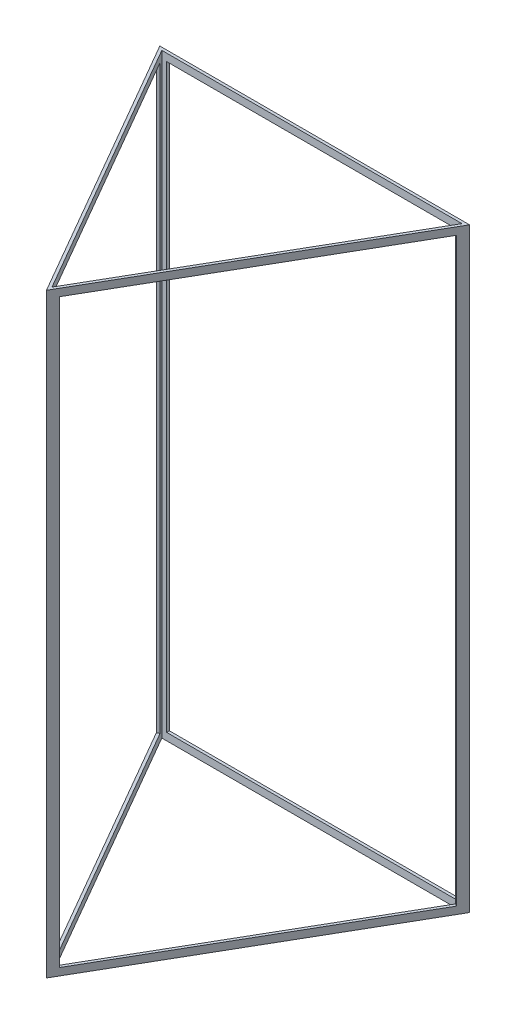
ISO-10303-21;
HEADER;
FILE_DESCRIPTION(('STEP AP214'),'2;1');
FILE_NAME('part.step','',(''),(''),'','','');
FILE_SCHEMA(('AUTOMOTIVE_DESIGN { 1 0 10303 214 1 1 1 1 }'));
ENDSEC;
DATA;
#1=APPLICATION_CONTEXT('core data for automotive mechanical design processes');
#2=APPLICATION_PROTOCOL_DEFINITION('international standard','automotive_design',2000,#1);
#3=PRODUCT_CONTEXT('',#1,'mechanical');
#4=PRODUCT('Part','Part','',(#3));
#5=PRODUCT_RELATED_PRODUCT_CATEGORY('part','',(#4));
#6=PRODUCT_DEFINITION_FORMATION('','',#4);
#7=PRODUCT_DEFINITION_CONTEXT('part definition',#1,'design');
#8=PRODUCT_DEFINITION('design','',#6,#7);
#9=PRODUCT_DEFINITION_SHAPE('','',#8);
#10=(LENGTH_UNIT() NAMED_UNIT(*) SI_UNIT(.MILLI.,.METRE.));
#11=(NAMED_UNIT(*) PLANE_ANGLE_UNIT() SI_UNIT($,.RADIAN.));
#12=(NAMED_UNIT(*) SI_UNIT($,.STERADIAN.) SOLID_ANGLE_UNIT());
#13=UNCERTAINTY_MEASURE_WITH_UNIT(LENGTH_MEASURE(1.E-05),#10,'distance_accuracy_value','');
#14=(GEOMETRIC_REPRESENTATION_CONTEXT(3) GLOBAL_UNCERTAINTY_ASSIGNED_CONTEXT((#13)) GLOBAL_UNIT_ASSIGNED_CONTEXT((#10,
#11,#12)) REPRESENTATION_CONTEXT('',''));
#15=CARTESIAN_POINT('',(0.,0.,0.));
#16=DIRECTION('',(0.,0.,1.));
#17=DIRECTION('',(1.,0.,0.));
#18=AXIS2_PLACEMENT_3D('',#15,#16,#17);
#19=CARTESIAN_POINT('',(0.,2500.,0.));
#20=DIRECTION('',(0.,1.,0.));
#21=DIRECTION('',(0.,0.,1.));
#22=AXIS2_PLACEMENT_3D('',#19,#20,#21);
#23=PLANE('',#22);
#24=DIRECTION('',(0.5,0.,0.866025403784439));
#25=VECTOR('',#24,1.);
#26=CARTESIAN_POINT('',(-650.,2500.,-1125.83302491977));
#27=LINE('',#26,#25);
#28=CARTESIAN_POINT('',(-650.,2500.,-1125.83302491977));
#29=VERTEX_POINT('',#28);
#30=CARTESIAN_POINT('',(0.,2500.,0.));
#31=VERTEX_POINT('',#30);
#32=EDGE_CURVE('E250',#29,#31,#27,.T.);
#33=ORIENTED_EDGE('',*,*,#32,.T.);
#34=DIRECTION('',(0.5,0.,-0.866025403784439));
#35=VECTOR('',#34,1.);
#36=CARTESIAN_POINT('',(0.,2500.,0.));
#37=LINE('',#36,#35);
#38=CARTESIAN_POINT('',(650.,2500.,-1125.83302491977));
#39=VERTEX_POINT('',#38);
#40=EDGE_CURVE('E253',#31,#39,#37,.T.);
#41=ORIENTED_EDGE('',*,*,#40,.T.);
#42=DIRECTION('',(-1.,0.,0.));
#43=VECTOR('',#42,1.);
#44=CARTESIAN_POINT('',(650.,2500.,-1125.83302491977));
#45=LINE('',#44,#43);
#46=EDGE_CURVE('E256',#39,#29,#45,.T.);
#47=ORIENTED_EDGE('',*,*,#46,.T.);
#48=EDGE_LOOP('',(#33,#41,#47));
#49=FACE_BOUND('',#48,.T.);
#50=DIRECTION('',(0.5,0.,-0.866025403784438));
#51=VECTOR('',#50,1.);
#52=CARTESIAN_POINT('',(8.40039843241769E-13,2500.,-23.0940107675844));
#53=LINE('',#52,#51);
#54=CARTESIAN_POINT('',(8.40039843241769E-13,2500.,-23.0940107675844));
#55=VERTEX_POINT('',#54);
#56=CARTESIAN_POINT('',(630.000000000001,2500.,-1114.28601953598));
#57=VERTEX_POINT('',#56);
#58=EDGE_CURVE('E228',#55,#57,#53,.T.);
#59=ORIENTED_EDGE('',*,*,#58,.F.);
#60=DIRECTION('',(0.5,0.,0.866025403784439));
#61=VECTOR('',#60,1.);
#62=CARTESIAN_POINT('',(-629.999999999999,2500.,-1114.28601953598));
#63=LINE('',#62,#61);
#64=CARTESIAN_POINT('',(-629.999999999999,2500.,-1114.28601953598));
#65=VERTEX_POINT('',#64);
#66=EDGE_CURVE('E226',#65,#55,#63,.T.);
#67=ORIENTED_EDGE('',*,*,#66,.F.);
#68=DIRECTION('',(-1.,0.,0.));
#69=VECTOR('',#68,1.);
#70=CARTESIAN_POINT('',(630.000000000001,2500.,-1114.28601953598));
#71=LINE('',#70,#69);
#72=EDGE_CURVE('E232',#57,#65,#71,.T.);
#73=ORIENTED_EDGE('',*,*,#72,.F.);
#74=EDGE_LOOP('',(#59,#67,#73));
#75=FACE_BOUND('',#74,.T.);
#76=ADVANCED_FACE('F33',(#49,#75),#23,.T.);
#77=CARTESIAN_POINT('',(0.,0.,0.));
#78=DIRECTION('',(0.,1.,0.));
#79=DIRECTION('',(0.,0.,1.));
#80=AXIS2_PLACEMENT_3D('',#77,#78,#79);
#81=PLANE('',#80);
#82=DIRECTION('',(0.5,0.,0.866025403784439));
#83=VECTOR('',#82,1.);
#84=CARTESIAN_POINT('',(-650.,0.,-1125.83302491977));
#85=LINE('',#84,#83);
#86=CARTESIAN_POINT('',(-650.,0.,-1125.83302491977));
#87=VERTEX_POINT('',#86);
#88=CARTESIAN_POINT('',(0.,0.,0.));
#89=VERTEX_POINT('',#88);
#90=EDGE_CURVE('E249',#87,#89,#85,.T.);
#91=ORIENTED_EDGE('',*,*,#90,.F.);
#92=DIRECTION('',(-1.,0.,0.));
#93=VECTOR('',#92,1.);
#94=CARTESIAN_POINT('',(650.,0.,-1125.83302491977));
#95=LINE('',#94,#93);
#96=CARTESIAN_POINT('',(650.,0.,-1125.83302491977));
#97=VERTEX_POINT('',#96);
#98=EDGE_CURVE('E254',#97,#87,#95,.T.);
#99=ORIENTED_EDGE('',*,*,#98,.F.);
#100=DIRECTION('',(0.5,0.,-0.866025403784439));
#101=VECTOR('',#100,1.);
#102=CARTESIAN_POINT('',(0.,0.,0.));
#103=LINE('',#102,#101);
#104=EDGE_CURVE('E261',#89,#97,#103,.T.);
#105=ORIENTED_EDGE('',*,*,#104,.F.);
#106=EDGE_LOOP('',(#91,#99,#105));
#107=FACE_BOUND('',#106,.T.);
#108=DIRECTION('',(0.5,0.,0.866025403784439));
#109=VECTOR('',#108,1.);
#110=CARTESIAN_POINT('',(-629.999999999999,0.,-1114.28601953598));
#111=LINE('',#110,#109);
#112=CARTESIAN_POINT('',(-629.999999999999,0.,-1114.28601953598));
#113=VERTEX_POINT('',#112);
#114=CARTESIAN_POINT('',(8.40039843241769E-13,0.,-23.0940107675844));
#115=VERTEX_POINT('',#114);
#116=EDGE_CURVE('E219',#113,#115,#111,.T.);
#117=ORIENTED_EDGE('',*,*,#116,.T.);
#118=DIRECTION('',(0.5,0.,-0.866025403784438));
#119=VECTOR('',#118,1.);
#120=CARTESIAN_POINT('',(8.40039843241769E-13,0.,-23.0940107675844));
#121=LINE('',#120,#119);
#122=CARTESIAN_POINT('',(630.000000000001,0.,-1114.28601953598));
#123=VERTEX_POINT('',#122);
#124=EDGE_CURVE('E237',#115,#123,#121,.T.);
#125=ORIENTED_EDGE('',*,*,#124,.T.);
#126=DIRECTION('',(-1.,0.,0.));
#127=VECTOR('',#126,1.);
#128=CARTESIAN_POINT('',(630.000000000001,0.,-1114.28601953598));
#129=LINE('',#128,#127);
#130=EDGE_CURVE('E229',#123,#113,#129,.T.);
#131=ORIENTED_EDGE('',*,*,#130,.T.);
#132=EDGE_LOOP('',(#117,#125,#131));
#133=FACE_BOUND('',#132,.T.);
#134=ADVANCED_FACE('F315',(#107,#133),#81,.F.);
#135=CARTESIAN_POINT('',(-650.,2500.,-1125.83302491977));
#136=DIRECTION('',(0.866025403784439,0.,-0.5));
#137=DIRECTION('',(-0.5,0.,-0.866025403784439));
#138=AXIS2_PLACEMENT_3D('',#135,#136,#137);
#139=PLANE('',#138);
#140=DIRECTION('',(-0.5,0.,-0.866025403784439));
#141=VECTOR('',#140,1.);
#142=CARTESIAN_POINT('',(-629.8,2469.2,-1090.84559860688));
#143=LINE('',#142,#141);
#144=CARTESIAN_POINT('',(-20.1999999999999,2469.2,-34.9874263128913));
#145=VERTEX_POINT('',#144);
#146=CARTESIAN_POINT('',(-629.8,2469.2,-1090.84559860688));
#147=VERTEX_POINT('',#146);
#148=EDGE_CURVE('E187',#145,#147,#143,.T.);
#149=ORIENTED_EDGE('',*,*,#148,.F.);
#150=DIRECTION('',(0.,1.,0.));
#151=VECTOR('',#150,1.);
#152=CARTESIAN_POINT('',(-20.1999999999999,30.7999999999999,-34.9874263128912));
#153=LINE('',#152,#151);
#154=CARTESIAN_POINT('',(-20.1999999999999,30.7999999999999,-34.9874263128912));
#155=VERTEX_POINT('',#154);
#156=EDGE_CURVE('E183',#155,#145,#153,.T.);
#157=ORIENTED_EDGE('',*,*,#156,.F.);
#158=DIRECTION('',(0.5,0.,0.866025403784439));
#159=VECTOR('',#158,1.);
#160=CARTESIAN_POINT('',(-629.8,30.7999999999999,-1090.84559860688));
#161=LINE('',#160,#159);
#162=CARTESIAN_POINT('',(-629.8,30.7999999999999,-1090.84559860688));
#163=VERTEX_POINT('',#162);
#164=EDGE_CURVE('E193',#163,#155,#161,.T.);
#165=ORIENTED_EDGE('',*,*,#164,.F.);
#166=DIRECTION('',(0.,-1.,0.));
#167=VECTOR('',#166,1.);
#168=CARTESIAN_POINT('',(-629.8,30.7999999999999,-1090.84559860688));
#169=LINE('',#168,#167);
#170=EDGE_CURVE('E190',#147,#163,#169,.T.);
#171=ORIENTED_EDGE('',*,*,#170,.F.);
#172=EDGE_LOOP('',(#149,#157,#165,#171));
#173=FACE_BOUND('',#172,.T.);
#174=ORIENTED_EDGE('',*,*,#90,.T.);
#175=DIRECTION('',(0.,-1.,0.));
#176=VECTOR('',#175,1.);
#177=CARTESIAN_POINT('',(0.,2500.,0.));
#178=LINE('',#177,#176);
#179=EDGE_CURVE('E269',#31,#89,#178,.T.);
#180=ORIENTED_EDGE('',*,*,#179,.F.);
#181=ORIENTED_EDGE('',*,*,#32,.F.);
#182=DIRECTION('',(0.,-1.,0.));
#183=VECTOR('',#182,1.);
#184=CARTESIAN_POINT('',(-650.,2500.,-1125.83302491977));
#185=LINE('',#184,#183);
#186=EDGE_CURVE('E258',#29,#87,#185,.T.);
#187=ORIENTED_EDGE('',*,*,#186,.T.);
#188=EDGE_LOOP('',(#174,#180,#181,#187));
#189=FACE_BOUND('',#188,.T.);
#190=ADVANCED_FACE('F35',(#173,#189),#139,.F.);
#191=CARTESIAN_POINT('',(0.,2500.,0.));
#192=DIRECTION('',(-0.866025403784439,0.,-0.5));
#193=DIRECTION('',(-0.5,0.,0.866025403784439));
#194=AXIS2_PLACEMENT_3D('',#191,#192,#193);
#195=PLANE('',#194);
#196=DIRECTION('',(-0.5,0.,0.866025403784439));
#197=VECTOR('',#196,1.);
#198=CARTESIAN_POINT('',(20.2000000000001,2469.2,-34.9874263128915));
#199=LINE('',#198,#197);
#200=CARTESIAN_POINT('',(629.8,2469.2,-1090.84559860688));
#201=VERTEX_POINT('',#200);
#202=CARTESIAN_POINT('',(20.2000000000001,2469.2,-34.9874263128915));
#203=VERTEX_POINT('',#202);
#204=EDGE_CURVE('E169',#201,#203,#199,.T.);
#205=ORIENTED_EDGE('',*,*,#204,.F.);
#206=DIRECTION('',(0.,1.,0.));
#207=VECTOR('',#206,1.);
#208=CARTESIAN_POINT('',(629.8,30.8000000000002,-1090.84559860688));
#209=LINE('',#208,#207);
#210=CARTESIAN_POINT('',(629.8,30.8000000000002,-1090.84559860688));
#211=VERTEX_POINT('',#210);
#212=EDGE_CURVE('E48',#211,#201,#209,.T.);
#213=ORIENTED_EDGE('',*,*,#212,.F.);
#214=DIRECTION('',(0.5,0.,-0.866025403784439));
#215=VECTOR('',#214,1.);
#216=CARTESIAN_POINT('',(20.2000000000001,30.8000000000002,-34.9874263128915));
#217=LINE('',#216,#215);
#218=CARTESIAN_POINT('',(20.2000000000001,30.8000000000002,-34.9874263128915));
#219=VERTEX_POINT('',#218);
#220=EDGE_CURVE('E176',#219,#211,#217,.T.);
#221=ORIENTED_EDGE('',*,*,#220,.F.);
#222=DIRECTION('',(0.,-1.,0.));
#223=VECTOR('',#222,1.);
#224=CARTESIAN_POINT('',(20.2000000000001,30.8000000000002,-34.9874263128915));
#225=LINE('',#224,#223);
#226=EDGE_CURVE('E160',#203,#219,#225,.T.);
#227=ORIENTED_EDGE('',*,*,#226,.F.);
#228=EDGE_LOOP('',(#205,#213,#221,#227));
#229=FACE_BOUND('',#228,.T.);
#230=ORIENTED_EDGE('',*,*,#104,.T.);
#231=DIRECTION('',(0.,-1.,0.));
#232=VECTOR('',#231,1.);
#233=CARTESIAN_POINT('',(650.,2500.,-1125.83302491977));
#234=LINE('',#233,#232);
#235=EDGE_CURVE('E266',#39,#97,#234,.T.);
#236=ORIENTED_EDGE('',*,*,#235,.F.);
#237=ORIENTED_EDGE('',*,*,#40,.F.);
#238=ORIENTED_EDGE('',*,*,#179,.T.);
#239=EDGE_LOOP('',(#230,#236,#237,#238));
#240=FACE_BOUND('',#239,.T.);
#241=ADVANCED_FACE('F173',(#229,#240),#195,.F.);
#242=CARTESIAN_POINT('',(650.,2500.,-1125.83302491977));
#243=DIRECTION('',(0.,0.,1.));
#244=DIRECTION('',(1.,0.,0.));
#245=AXIS2_PLACEMENT_3D('',#242,#243,#244);
#246=PLANE('',#245);
#247=DIRECTION('',(1.,0.,0.));
#248=VECTOR('',#247,1.);
#249=CARTESIAN_POINT('',(609.6,2469.2,-1125.83302491977));
#250=LINE('',#249,#248);
#251=CARTESIAN_POINT('',(-609.6,2469.2,-1125.83302491977));
#252=VERTEX_POINT('',#251);
#253=CARTESIAN_POINT('',(609.6,2469.2,-1125.83302491977));
#254=VERTEX_POINT('',#253);
#255=EDGE_CURVE('E207',#252,#254,#250,.T.);
#256=ORIENTED_EDGE('',*,*,#255,.F.);
#257=DIRECTION('',(0.,1.,0.));
#258=VECTOR('',#257,1.);
#259=CARTESIAN_POINT('',(-609.6,30.8000000000004,-1125.83302491977));
#260=LINE('',#259,#258);
#261=CARTESIAN_POINT('',(-609.6,30.8000000000004,-1125.83302491977));
#262=VERTEX_POINT('',#261);
#263=EDGE_CURVE('E199',#262,#252,#260,.T.);
#264=ORIENTED_EDGE('',*,*,#263,.F.);
#265=DIRECTION('',(-1.,0.,0.));
#266=VECTOR('',#265,1.);
#267=CARTESIAN_POINT('',(609.6,30.8000000000004,-1125.83302491977));
#268=LINE('',#267,#266);
#269=CARTESIAN_POINT('',(609.6,30.8000000000004,-1125.83302491977));
#270=VERTEX_POINT('',#269);
#271=EDGE_CURVE('E213',#270,#262,#268,.T.);
#272=ORIENTED_EDGE('',*,*,#271,.F.);
#273=DIRECTION('',(0.,-1.,0.));
#274=VECTOR('',#273,1.);
#275=CARTESIAN_POINT('',(609.6,30.8000000000004,-1125.83302491977));
#276=LINE('',#275,#274);
#277=EDGE_CURVE('E210',#254,#270,#276,.T.);
#278=ORIENTED_EDGE('',*,*,#277,.F.);
#279=EDGE_LOOP('',(#256,#264,#272,#278));
#280=FACE_BOUND('',#279,.T.);
#281=ORIENTED_EDGE('',*,*,#98,.T.);
#282=ORIENTED_EDGE('',*,*,#186,.F.);
#283=ORIENTED_EDGE('',*,*,#46,.F.);
#284=ORIENTED_EDGE('',*,*,#235,.T.);
#285=EDGE_LOOP('',(#281,#282,#283,#284));
#286=FACE_BOUND('',#285,.T.);
#287=ADVANCED_FACE('F328',(#280,#286),#246,.F.);
#288=CARTESIAN_POINT('',(-629.999999999999,2500.,-1114.28601953598));
#289=DIRECTION('',(0.866025403784439,0.,-0.5));
#290=DIRECTION('',(-0.5,0.,-0.866025403784439));
#291=AXIS2_PLACEMENT_3D('',#288,#289,#290);
#292=PLANE('',#291);
#293=DIRECTION('',(0.,-1.,0.));
#294=VECTOR('',#293,1.);
#295=CARTESIAN_POINT('',(-10.1999999999994,2500.,-40.7609290047874));
#296=LINE('',#295,#294);
#297=CARTESIAN_POINT('',(-10.1999999999995,2469.2,-40.7609290047877));
#298=VERTEX_POINT('',#297);
#299=CARTESIAN_POINT('',(-10.1999999999995,30.8000000000001,-40.7609290047877));
#300=VERTEX_POINT('',#299);
#301=EDGE_CURVE('E288',#298,#300,#296,.T.);
#302=ORIENTED_EDGE('',*,*,#301,.F.);
#303=DIRECTION('',(0.5,0.,0.866025403784439));
#304=VECTOR('',#303,1.);
#305=CARTESIAN_POINT('',(-629.999999999999,2469.2,-1114.28601953598));
#306=LINE('',#305,#304);
#307=CARTESIAN_POINT('',(-619.799999999999,2469.2,-1096.61910129878));
#308=VERTEX_POINT('',#307);
#309=EDGE_CURVE('E281',#308,#298,#306,.T.);
#310=ORIENTED_EDGE('',*,*,#309,.F.);
#311=DIRECTION('',(0.,1.,0.));
#312=VECTOR('',#311,1.);
#313=CARTESIAN_POINT('',(-619.799999999999,2500.,-1096.61910129878));
#314=LINE('',#313,#312);
#315=CARTESIAN_POINT('',(-619.799999999999,30.7999999999999,-1096.61910129878));
#316=VERTEX_POINT('',#315);
#317=EDGE_CURVE('E283',#316,#308,#314,.T.);
#318=ORIENTED_EDGE('',*,*,#317,.F.);
#319=DIRECTION('',(-0.5,0.,-0.866025403784439));
#320=VECTOR('',#319,1.);
#321=CARTESIAN_POINT('',(-629.999999999999,30.8000000000002,-1114.28601953598));
#322=LINE('',#321,#320);
#323=EDGE_CURVE('E286',#300,#316,#322,.T.);
#324=ORIENTED_EDGE('',*,*,#323,.F.);
#325=EDGE_LOOP('',(#302,#310,#318,#324));
#326=FACE_BOUND('',#325,.T.);
#327=ORIENTED_EDGE('',*,*,#116,.F.);
#328=DIRECTION('',(0.,-1.,0.));
#329=VECTOR('',#328,1.);
#330=CARTESIAN_POINT('',(-629.999999999999,2500.,-1114.28601953598));
#331=LINE('',#330,#329);
#332=EDGE_CURVE('E234',#65,#113,#331,.T.);
#333=ORIENTED_EDGE('',*,*,#332,.F.);
#334=ORIENTED_EDGE('',*,*,#66,.T.);
#335=DIRECTION('',(0.,-1.,0.));
#336=VECTOR('',#335,1.);
#337=CARTESIAN_POINT('',(8.40039843241769E-13,2500.,-23.0940107675844));
#338=LINE('',#337,#336);
#339=EDGE_CURVE('E246',#55,#115,#338,.T.);
#340=ORIENTED_EDGE('',*,*,#339,.T.);
#341=EDGE_LOOP('',(#327,#333,#334,#340));
#342=FACE_BOUND('',#341,.T.);
#343=ADVANCED_FACE('F325',(#326,#342),#292,.T.);
#344=CARTESIAN_POINT('',(8.40039843241769E-13,2500.,-23.0940107675844));
#345=DIRECTION('',(-0.866025403784439,0.,-0.5));
#346=DIRECTION('',(-0.5,0.,0.866025403784439));
#347=AXIS2_PLACEMENT_3D('',#344,#345,#346);
#348=PLANE('',#347);
#349=DIRECTION('',(0.,-1.,0.));
#350=VECTOR('',#349,1.);
#351=CARTESIAN_POINT('',(619.800000000001,2500.,-1096.61910129878));
#352=LINE('',#351,#350);
#353=CARTESIAN_POINT('',(619.800000000001,2469.2,-1096.61910129878));
#354=VERTEX_POINT('',#353);
#355=CARTESIAN_POINT('',(619.800000000001,30.8000000000002,-1096.61910129878));
#356=VERTEX_POINT('',#355);
#357=EDGE_CURVE('E11',#354,#356,#352,.T.);
#358=ORIENTED_EDGE('',*,*,#357,.F.);
#359=DIRECTION('',(0.5,0.,-0.866025403784439));
#360=VECTOR('',#359,1.);
#361=CARTESIAN_POINT('',(8.40039843241769E-13,2469.2,-23.0940107675844));
#362=LINE('',#361,#360);
#363=CARTESIAN_POINT('',(10.200000000001,2469.2,-40.7609290047873));
#364=VERTEX_POINT('',#363);
#365=EDGE_CURVE('E290',#364,#354,#362,.T.);
#366=ORIENTED_EDGE('',*,*,#365,.F.);
#367=DIRECTION('',(0.,1.,0.));
#368=VECTOR('',#367,1.);
#369=CARTESIAN_POINT('',(10.200000000001,2500.,-40.7609290047873));
#370=LINE('',#369,#368);
#371=CARTESIAN_POINT('',(10.200000000001,30.8000000000002,-40.7609290047873));
#372=VERTEX_POINT('',#371);
#373=EDGE_CURVE('E163',#372,#364,#370,.T.);
#374=ORIENTED_EDGE('',*,*,#373,.F.);
#375=DIRECTION('',(-0.5,0.,0.866025403784439));
#376=VECTOR('',#375,1.);
#377=CARTESIAN_POINT('',(8.40039843241769E-13,30.8000000000002,-23.0940107675844));
#378=LINE('',#377,#376);
#379=EDGE_CURVE('E41',#356,#372,#378,.T.);
#380=ORIENTED_EDGE('',*,*,#379,.F.);
#381=EDGE_LOOP('',(#358,#366,#374,#380));
#382=FACE_BOUND('',#381,.T.);
#383=ORIENTED_EDGE('',*,*,#124,.F.);
#384=ORIENTED_EDGE('',*,*,#339,.F.);
#385=ORIENTED_EDGE('',*,*,#58,.T.);
#386=DIRECTION('',(0.,-1.,0.));
#387=VECTOR('',#386,1.);
#388=CARTESIAN_POINT('',(630.000000000001,2500.,-1114.28601953598));
#389=LINE('',#388,#387);
#390=EDGE_CURVE('E244',#57,#123,#389,.T.);
#391=ORIENTED_EDGE('',*,*,#390,.T.);
#392=EDGE_LOOP('',(#383,#384,#385,#391));
#393=FACE_BOUND('',#392,.T.);
#394=ADVANCED_FACE('F298',(#382,#393),#348,.T.);
#395=CARTESIAN_POINT('',(630.000000000001,2500.,-1114.28601953598));
#396=DIRECTION('',(0.,0.,1.));
#397=DIRECTION('',(1.,0.,0.));
#398=AXIS2_PLACEMENT_3D('',#395,#396,#397);
#399=PLANE('',#398);
#400=DIRECTION('',(0.,-1.,0.));
#401=VECTOR('',#400,1.);
#402=CARTESIAN_POINT('',(-609.6,2500.,-1114.28601953598));
#403=LINE('',#402,#401);
#404=CARTESIAN_POINT('',(-609.6,2469.2,-1114.28601953598));
#405=VERTEX_POINT('',#404);
#406=CARTESIAN_POINT('',(-609.6,30.8000000000004,-1114.28601953598));
#407=VERTEX_POINT('',#406);
#408=EDGE_CURVE('E279',#405,#407,#403,.T.);
#409=ORIENTED_EDGE('',*,*,#408,.F.);
#410=DIRECTION('',(-1.,0.,0.));
#411=VECTOR('',#410,1.);
#412=CARTESIAN_POINT('',(630.000000000001,2469.2,-1114.28601953598));
#413=LINE('',#412,#411);
#414=CARTESIAN_POINT('',(609.6,2469.2,-1114.28601953598));
#415=VERTEX_POINT('',#414);
#416=EDGE_CURVE('E272',#415,#405,#413,.T.);
#417=ORIENTED_EDGE('',*,*,#416,.F.);
#418=DIRECTION('',(0.,1.,0.));
#419=VECTOR('',#418,1.);
#420=CARTESIAN_POINT('',(609.6,2500.,-1114.28601953598));
#421=LINE('',#420,#419);
#422=CARTESIAN_POINT('',(609.6,30.8000000000004,-1114.28601953598));
#423=VERTEX_POINT('',#422);
#424=EDGE_CURVE('E274',#423,#415,#421,.T.);
#425=ORIENTED_EDGE('',*,*,#424,.F.);
#426=DIRECTION('',(1.,0.,0.));
#427=VECTOR('',#426,1.);
#428=CARTESIAN_POINT('',(630.000000000001,30.8000000000002,-1114.28601953598));
#429=LINE('',#428,#427);
#430=EDGE_CURVE('E277',#407,#423,#429,.T.);
#431=ORIENTED_EDGE('',*,*,#430,.F.);
#432=EDGE_LOOP('',(#409,#417,#425,#431));
#433=FACE_BOUND('',#432,.T.);
#434=ORIENTED_EDGE('',*,*,#130,.F.);
#435=ORIENTED_EDGE('',*,*,#390,.F.);
#436=ORIENTED_EDGE('',*,*,#72,.T.);
#437=ORIENTED_EDGE('',*,*,#332,.T.);
#438=EDGE_LOOP('',(#434,#435,#436,#437));
#439=FACE_BOUND('',#438,.T.);
#440=ADVANCED_FACE('F357',(#433,#439),#399,.T.);
#441=CARTESIAN_POINT('',(-609.6,30.8000000000004,-1104.83302491977));
#442=DIRECTION('',(-1.,0.,0.));
#443=DIRECTION('',(0.,0.,1.));
#444=AXIS2_PLACEMENT_3D('',#441,#442,#443);
#445=PLANE('',#444);
#446=ORIENTED_EDGE('',*,*,#408,.T.);
#447=DIRECTION('',(0.,0.,-1.));
#448=VECTOR('',#447,1.);
#449=CARTESIAN_POINT('',(-609.6,30.8000000000004,-1104.83302491977));
#450=LINE('',#449,#448);
#451=EDGE_CURVE('E217',#407,#262,#450,.T.);
#452=ORIENTED_EDGE('',*,*,#451,.T.);
#453=ORIENTED_EDGE('',*,*,#263,.T.);
#454=DIRECTION('',(0.,0.,-1.));
#455=VECTOR('',#454,1.);
#456=CARTESIAN_POINT('',(-609.6,2469.2,-1104.83302491977));
#457=LINE('',#456,#455);
#458=EDGE_CURVE('E216',#405,#252,#457,.T.);
#459=ORIENTED_EDGE('',*,*,#458,.F.);
#460=EDGE_LOOP('',(#446,#452,#453,#459));
#461=FACE_BOUND('',#460,.T.);
#462=ADVANCED_FACE('F365',(#461),#445,.F.);
#463=CARTESIAN_POINT('',(609.6,30.8000000000004,-1104.83302491977));
#464=DIRECTION('',(0.,-1.,0.));
#465=DIRECTION('',(0.,0.,-1.));
#466=AXIS2_PLACEMENT_3D('',#463,#464,#465);
#467=PLANE('',#466);
#468=ORIENTED_EDGE('',*,*,#430,.T.);
#469=DIRECTION('',(0.,0.,-1.));
#470=VECTOR('',#469,1.);
#471=CARTESIAN_POINT('',(609.6,30.8000000000004,-1104.83302491977));
#472=LINE('',#471,#470);
#473=EDGE_CURVE('E220',#423,#270,#472,.T.);
#474=ORIENTED_EDGE('',*,*,#473,.T.);
#475=ORIENTED_EDGE('',*,*,#271,.T.);
#476=ORIENTED_EDGE('',*,*,#451,.F.);
#477=EDGE_LOOP('',(#468,#474,#475,#476));
#478=FACE_BOUND('',#477,.T.);
#479=ADVANCED_FACE('F372',(#478),#467,.F.);
#480=CARTESIAN_POINT('',(609.6,30.8000000000004,-1104.83302491977));
#481=DIRECTION('',(1.,0.,0.));
#482=DIRECTION('',(0.,0.,-1.));
#483=AXIS2_PLACEMENT_3D('',#480,#481,#482);
#484=PLANE('',#483);
#485=ORIENTED_EDGE('',*,*,#424,.T.);
#486=DIRECTION('',(0.,0.,-1.));
#487=VECTOR('',#486,1.);
#488=CARTESIAN_POINT('',(609.6,2469.2,-1104.83302491977));
#489=LINE('',#488,#487);
#490=EDGE_CURVE('E222',#415,#254,#489,.T.);
#491=ORIENTED_EDGE('',*,*,#490,.T.);
#492=ORIENTED_EDGE('',*,*,#277,.T.);
#493=ORIENTED_EDGE('',*,*,#473,.F.);
#494=EDGE_LOOP('',(#485,#491,#492,#493));
#495=FACE_BOUND('',#494,.T.);
#496=ADVANCED_FACE('F378',(#495),#484,.F.);
#497=CARTESIAN_POINT('',(609.6,2469.2,-1104.83302491977));
#498=DIRECTION('',(0.,1.,0.));
#499=DIRECTION('',(0.,0.,1.));
#500=AXIS2_PLACEMENT_3D('',#497,#498,#499);
#501=PLANE('',#500);
#502=ORIENTED_EDGE('',*,*,#416,.T.);
#503=ORIENTED_EDGE('',*,*,#458,.T.);
#504=ORIENTED_EDGE('',*,*,#255,.T.);
#505=ORIENTED_EDGE('',*,*,#490,.F.);
#506=EDGE_LOOP('',(#502,#503,#504,#505));
#507=FACE_BOUND('',#506,.T.);
#508=ADVANCED_FACE('F374',(#507),#501,.F.);
#509=CARTESIAN_POINT('',(-2.01346652052638,30.7999999999999,-45.4874263128914));
#510=DIRECTION('',(0.5,0.,0.866025403784439));
#511=DIRECTION('',(0.866025403784439,0.,-0.5));
#512=AXIS2_PLACEMENT_3D('',#509,#510,#511);
#513=PLANE('',#512);
#514=ORIENTED_EDGE('',*,*,#301,.T.);
#515=DIRECTION('',(-0.866025403784439,0.,0.5));
#516=VECTOR('',#515,1.);
#517=CARTESIAN_POINT('',(-2.01346652052638,30.7999999999999,-45.4874263128914));
#518=LINE('',#517,#516);
#519=EDGE_CURVE('E197',#300,#155,#518,.T.);
#520=ORIENTED_EDGE('',*,*,#519,.T.);
#521=ORIENTED_EDGE('',*,*,#156,.T.);
#522=DIRECTION('',(-0.866025403784439,0.,0.5));
#523=VECTOR('',#522,1.);
#524=CARTESIAN_POINT('',(-2.01346652052638,2469.2,-45.4874263128914));
#525=LINE('',#524,#523);
#526=EDGE_CURVE('E196',#298,#145,#525,.T.);
#527=ORIENTED_EDGE('',*,*,#526,.F.);
#528=EDGE_LOOP('',(#514,#520,#521,#527));
#529=FACE_BOUND('',#528,.T.);
#530=ADVANCED_FACE('F377',(#529),#513,.F.);
#531=CARTESIAN_POINT('',(-611.613466520526,30.7999999999999,-1101.34559860688));
#532=DIRECTION('',(0.,-1.,0.));
#533=DIRECTION('',(0.,0.,-1.));
#534=AXIS2_PLACEMENT_3D('',#531,#532,#533);
#535=PLANE('',#534);
#536=ORIENTED_EDGE('',*,*,#323,.T.);
#537=DIRECTION('',(-0.866025403784439,0.,0.5));
#538=VECTOR('',#537,1.);
#539=CARTESIAN_POINT('',(-611.613466520526,30.7999999999999,-1101.34559860688));
#540=LINE('',#539,#538);
#541=EDGE_CURVE('E200',#316,#163,#540,.T.);
#542=ORIENTED_EDGE('',*,*,#541,.T.);
#543=ORIENTED_EDGE('',*,*,#164,.T.);
#544=ORIENTED_EDGE('',*,*,#519,.F.);
#545=EDGE_LOOP('',(#536,#542,#543,#544));
#546=FACE_BOUND('',#545,.T.);
#547=ADVANCED_FACE('F387',(#546),#535,.F.);
#548=CARTESIAN_POINT('',(-611.613466520526,30.7999999999999,-1101.34559860688));
#549=DIRECTION('',(-0.5,0.,-0.866025403784439));
#550=DIRECTION('',(-0.866025403784439,0.,0.5));
#551=AXIS2_PLACEMENT_3D('',#548,#549,#550);
#552=PLANE('',#551);
#553=ORIENTED_EDGE('',*,*,#317,.T.);
#554=DIRECTION('',(-0.866025403784439,0.,0.5));
#555=VECTOR('',#554,1.);
#556=CARTESIAN_POINT('',(-611.613466520526,2469.2,-1101.34559860688));
#557=LINE('',#556,#555);
#558=EDGE_CURVE('E202',#308,#147,#557,.T.);
#559=ORIENTED_EDGE('',*,*,#558,.T.);
#560=ORIENTED_EDGE('',*,*,#170,.T.);
#561=ORIENTED_EDGE('',*,*,#541,.F.);
#562=EDGE_LOOP('',(#553,#559,#560,#561));
#563=FACE_BOUND('',#562,.T.);
#564=ADVANCED_FACE('F309',(#563),#552,.F.);
#565=CARTESIAN_POINT('',(-611.613466520526,2469.2,-1101.34559860688));
#566=DIRECTION('',(0.,1.,0.));
#567=DIRECTION('',(0.,0.,1.));
#568=AXIS2_PLACEMENT_3D('',#565,#566,#567);
#569=PLANE('',#568);
#570=ORIENTED_EDGE('',*,*,#309,.T.);
#571=ORIENTED_EDGE('',*,*,#526,.T.);
#572=ORIENTED_EDGE('',*,*,#148,.T.);
#573=ORIENTED_EDGE('',*,*,#558,.F.);
#574=EDGE_LOOP('',(#570,#571,#572,#573));
#575=FACE_BOUND('',#574,.T.);
#576=ADVANCED_FACE('F302',(#575),#569,.F.);
#577=CARTESIAN_POINT('',(611.613466520527,30.8000000000002,-1101.34559860688));
#578=DIRECTION('',(0.5,0.,-0.866025403784439));
#579=DIRECTION('',(-0.866025403784439,0.,-0.5));
#580=AXIS2_PLACEMENT_3D('',#577,#578,#579);
#581=PLANE('',#580);
#582=ORIENTED_EDGE('',*,*,#357,.T.);
#583=DIRECTION('',(0.866025403784439,0.,0.5));
#584=VECTOR('',#583,1.);
#585=CARTESIAN_POINT('',(611.613466520527,30.8000000000002,-1101.34559860688));
#586=LINE('',#585,#584);
#587=EDGE_CURVE('E181',#356,#211,#586,.T.);
#588=ORIENTED_EDGE('',*,*,#587,.T.);
#589=ORIENTED_EDGE('',*,*,#212,.T.);
#590=DIRECTION('',(0.866025403784439,0.,0.5));
#591=VECTOR('',#590,1.);
#592=CARTESIAN_POINT('',(611.613466520527,2469.2,-1101.34559860688));
#593=LINE('',#592,#591);
#594=EDGE_CURVE('E166',#354,#201,#593,.T.);
#595=ORIENTED_EDGE('',*,*,#594,.F.);
#596=EDGE_LOOP('',(#582,#588,#589,#595));
#597=FACE_BOUND('',#596,.T.);
#598=ADVANCED_FACE('F300',(#597),#581,.F.);
#599=CARTESIAN_POINT('',(2.01346652052656,30.8000000000002,-45.4874263128917));
#600=DIRECTION('',(0.,-1.,0.));
#601=DIRECTION('',(0.,0.,-1.));
#602=AXIS2_PLACEMENT_3D('',#599,#600,#601);
#603=PLANE('',#602);
#604=ORIENTED_EDGE('',*,*,#379,.T.);
#605=DIRECTION('',(0.866025403784439,0.,0.5));
#606=VECTOR('',#605,1.);
#607=CARTESIAN_POINT('',(2.01346652052656,30.8000000000002,-45.4874263128917));
#608=LINE('',#607,#606);
#609=EDGE_CURVE('E165',#372,#219,#608,.T.);
#610=ORIENTED_EDGE('',*,*,#609,.T.);
#611=ORIENTED_EDGE('',*,*,#220,.T.);
#612=ORIENTED_EDGE('',*,*,#587,.F.);
#613=EDGE_LOOP('',(#604,#610,#611,#612));
#614=FACE_BOUND('',#613,.T.);
#615=ADVANCED_FACE('F295',(#614),#603,.F.);
#616=CARTESIAN_POINT('',(2.01346652052656,30.8000000000002,-45.4874263128917));
#617=DIRECTION('',(-0.5,0.,0.866025403784439));
#618=DIRECTION('',(0.866025403784439,0.,0.5));
#619=AXIS2_PLACEMENT_3D('',#616,#617,#618);
#620=PLANE('',#619);
#621=ORIENTED_EDGE('',*,*,#373,.T.);
#622=DIRECTION('',(0.866025403784439,0.,0.5));
#623=VECTOR('',#622,1.);
#624=CARTESIAN_POINT('',(2.01346652052656,2469.2,-45.4874263128917));
#625=LINE('',#624,#623);
#626=EDGE_CURVE('E56',#364,#203,#625,.T.);
#627=ORIENTED_EDGE('',*,*,#626,.T.);
#628=ORIENTED_EDGE('',*,*,#226,.T.);
#629=ORIENTED_EDGE('',*,*,#609,.F.);
#630=EDGE_LOOP('',(#621,#627,#628,#629));
#631=FACE_BOUND('',#630,.T.);
#632=ADVANCED_FACE('F157',(#631),#620,.F.);
#633=CARTESIAN_POINT('',(2.01346652052656,2469.2,-45.4874263128917));
#634=DIRECTION('',(0.,1.,0.));
#635=DIRECTION('',(0.,0.,1.));
#636=AXIS2_PLACEMENT_3D('',#633,#634,#635);
#637=PLANE('',#636);
#638=ORIENTED_EDGE('',*,*,#365,.T.);
#639=ORIENTED_EDGE('',*,*,#594,.T.);
#640=ORIENTED_EDGE('',*,*,#204,.T.);
#641=ORIENTED_EDGE('',*,*,#626,.F.);
#642=EDGE_LOOP('',(#638,#639,#640,#641));
#643=FACE_BOUND('',#642,.T.);
#644=ADVANCED_FACE('F170',(#643),#637,.F.);
#645=CLOSED_SHELL('',(#76,#134,#190,#241,#287,#343,#394,#440,#462,#479,#496,#508,#530,#547,#564,
#576,#598,#615,#632,#644));
#646=MANIFOLD_SOLID_BREP('B2',#645);
#647=ADVANCED_BREP_SHAPE_REPRESENTATION('',(#18,#646),#14);
#648=SHAPE_DEFINITION_REPRESENTATION(#9,#647);
ENDSEC;
END-ISO-10303-21;
